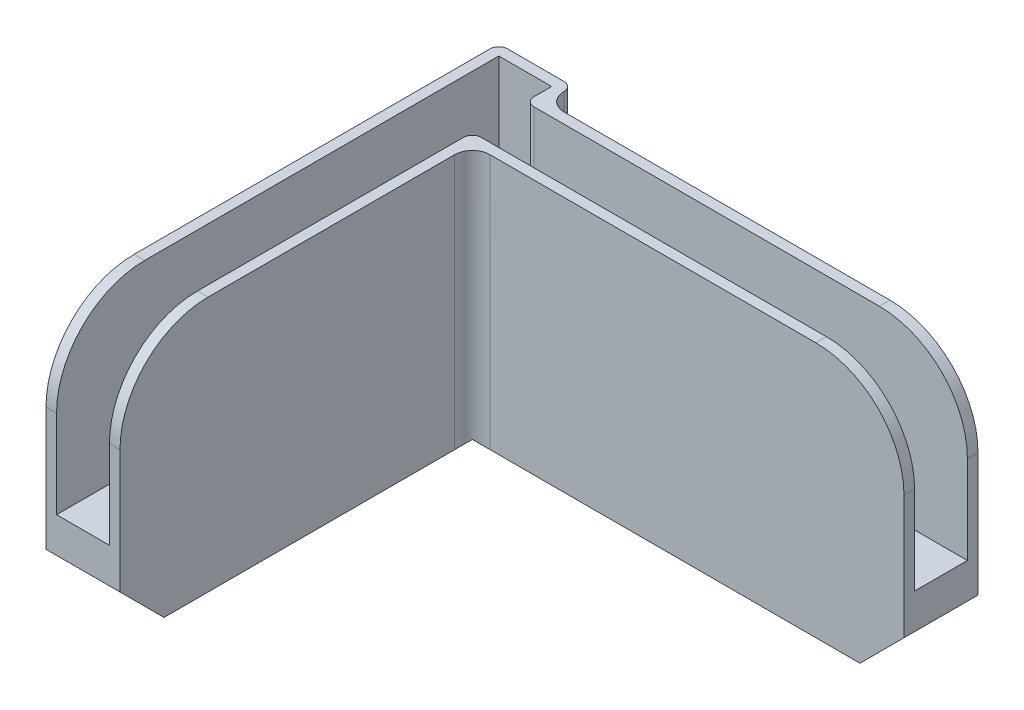
ISO-10303-21;
HEADER;
FILE_DESCRIPTION(('STEP AP214'),'2;1');
FILE_NAME('part.step','',(''),(''),'','','');
FILE_SCHEMA(('AUTOMOTIVE_DESIGN { 1 0 10303 214 1 1 1 1 }'));
ENDSEC;
DATA;
#1=APPLICATION_CONTEXT('core data for automotive mechanical design processes');
#2=APPLICATION_PROTOCOL_DEFINITION('international standard','automotive_design',2000,#1);
#3=PRODUCT_CONTEXT('',#1,'mechanical');
#4=PRODUCT('Part','Part','',(#3));
#5=PRODUCT_RELATED_PRODUCT_CATEGORY('part','',(#4));
#6=PRODUCT_DEFINITION_FORMATION('','',#4);
#7=PRODUCT_DEFINITION_CONTEXT('part definition',#1,'design');
#8=PRODUCT_DEFINITION('design','',#6,#7);
#9=PRODUCT_DEFINITION_SHAPE('','',#8);
#10=(LENGTH_UNIT() NAMED_UNIT(*) SI_UNIT(.MILLI.,.METRE.));
#11=(NAMED_UNIT(*) PLANE_ANGLE_UNIT() SI_UNIT($,.RADIAN.));
#12=(NAMED_UNIT(*) SI_UNIT($,.STERADIAN.) SOLID_ANGLE_UNIT());
#13=UNCERTAINTY_MEASURE_WITH_UNIT(LENGTH_MEASURE(1.E-05),#10,'distance_accuracy_value','');
#14=(GEOMETRIC_REPRESENTATION_CONTEXT(3) GLOBAL_UNCERTAINTY_ASSIGNED_CONTEXT((#13)) GLOBAL_UNIT_ASSIGNED_CONTEXT((#10,
#11,#12)) REPRESENTATION_CONTEXT('',''));
#15=CARTESIAN_POINT('',(0.,0.,0.));
#16=DIRECTION('',(0.,0.,1.));
#17=DIRECTION('',(1.,0.,0.));
#18=AXIS2_PLACEMENT_3D('',#15,#16,#17);
#19=CARTESIAN_POINT('',(0.,20.,0.));
#20=DIRECTION('',(0.,1.,0.));
#21=DIRECTION('',(0.,0.,1.));
#22=AXIS2_PLACEMENT_3D('',#19,#20,#21);
#23=PLANE('',#22);
#24=DIRECTION('',(0.,0.,-1.));
#25=VECTOR('',#24,1.);
#26=CARTESIAN_POINT('',(-49.,20.,-9.));
#27=LINE('',#26,#25);
#28=CARTESIAN_POINT('',(-49.,20.,-7.));
#29=VERTEX_POINT('',#28);
#30=CARTESIAN_POINT('',(-49.,20.,-9.));
#31=VERTEX_POINT('',#30);
#32=EDGE_CURVE('E329',#29,#31,#27,.T.);
#33=ORIENTED_EDGE('',*,*,#32,.F.);
#34=CARTESIAN_POINT('',(-48.,20.,-7.));
#35=DIRECTION('',(0.,1.,0.));
#36=DIRECTION('',(0.,0.,1.));
#37=AXIS2_PLACEMENT_3D('',#34,#35,#36);
#38=CIRCLE('',#37,1.);
#39=CARTESIAN_POINT('',(-48.,20.,-6.));
#40=VERTEX_POINT('',#39);
#41=EDGE_CURVE('E501',#29,#40,#38,.T.);
#42=ORIENTED_EDGE('',*,*,#41,.T.);
#43=DIRECTION('',(-1.,0.,0.));
#44=VECTOR('',#43,1.);
#45=CARTESIAN_POINT('',(-49.,20.,-6.));
#46=LINE('',#45,#44);
#47=CARTESIAN_POINT('',(-8.8,20.,-6.));
#48=VERTEX_POINT('',#47);
#49=EDGE_CURVE('E326',#48,#40,#46,.T.);
#50=ORIENTED_EDGE('',*,*,#49,.F.);
#51=DIRECTION('',(0.,0.,-1.));
#52=VECTOR('',#51,1.);
#53=CARTESIAN_POINT('',(-8.8,20.,-7.2));
#54=LINE('',#53,#52);
#55=CARTESIAN_POINT('',(-8.8,20.,-7.2));
#56=VERTEX_POINT('',#55);
#57=EDGE_CURVE('E438',#48,#56,#54,.T.);
#58=ORIENTED_EDGE('',*,*,#57,.T.);
#59=DIRECTION('',(-1.,0.,0.));
#60=VECTOR('',#59,1.);
#61=CARTESIAN_POINT('',(0.,20.,-7.2));
#62=LINE('',#61,#60);
#63=CARTESIAN_POINT('',(-45.8,20.,-7.2));
#64=VERTEX_POINT('',#63);
#65=EDGE_CURVE('E355',#56,#64,#62,.T.);
#66=ORIENTED_EDGE('',*,*,#65,.T.);
#67=CARTESIAN_POINT('',(-45.8,20.,-9.2));
#68=DIRECTION('',(0.,1.,0.));
#69=DIRECTION('',(0.,0.,1.));
#70=AXIS2_PLACEMENT_3D('',#67,#68,#69);
#71=CIRCLE('',#70,2.);
#72=CARTESIAN_POINT('',(-47.8,20.,-9.2));
#73=VERTEX_POINT('',#72);
#74=EDGE_CURVE('E490',#64,#73,#71,.F.);
#75=ORIENTED_EDGE('',*,*,#74,.T.);
#76=CARTESIAN_POINT('',(-48.8,20.,-9.2));
#77=DIRECTION('',(0.,1.,0.));
#78=DIRECTION('',(0.,0.,1.));
#79=AXIS2_PLACEMENT_3D('',#76,#77,#78);
#80=CIRCLE('',#79,1.);
#81=CARTESIAN_POINT('',(-48.8,20.,-10.2));
#82=VERTEX_POINT('',#81);
#83=EDGE_CURVE('E497',#73,#82,#80,.T.);
#84=ORIENTED_EDGE('',*,*,#83,.T.);
#85=DIRECTION('',(-1.,0.,0.));
#86=VECTOR('',#85,1.);
#87=CARTESIAN_POINT('',(0.,20.,-10.2));
#88=LINE('',#87,#86);
#89=CARTESIAN_POINT('',(-55.2,20.,-10.2));
#90=VERTEX_POINT('',#89);
#91=EDGE_CURVE('E358',#82,#90,#88,.T.);
#92=ORIENTED_EDGE('',*,*,#91,.T.);
#93=CARTESIAN_POINT('',(-55.2,20.,-9.2));
#94=DIRECTION('',(0.,1.,0.));
#95=DIRECTION('',(0.,0.,1.));
#96=AXIS2_PLACEMENT_3D('',#93,#94,#95);
#97=CIRCLE('',#96,1.);
#98=CARTESIAN_POINT('',(-56.2,20.,-9.2));
#99=VERTEX_POINT('',#98);
#100=EDGE_CURVE('E499',#90,#99,#97,.T.);
#101=ORIENTED_EDGE('',*,*,#100,.T.);
#102=DIRECTION('',(0.,0.,1.));
#103=VECTOR('',#102,1.);
#104=CARTESIAN_POINT('',(-56.2,20.,0.));
#105=LINE('',#104,#103);
#106=CARTESIAN_POINT('',(-56.2,20.,31.2));
#107=VERTEX_POINT('',#106);
#108=EDGE_CURVE('E361',#99,#107,#105,.T.);
#109=ORIENTED_EDGE('',*,*,#108,.T.);
#110=DIRECTION('',(1.,0.,0.));
#111=VECTOR('',#110,1.);
#112=CARTESIAN_POINT('',(-55.,20.,31.2));
#113=LINE('',#112,#111);
#114=CARTESIAN_POINT('',(-55.,20.,31.2));
#115=VERTEX_POINT('',#114);
#116=EDGE_CURVE('E434',#107,#115,#113,.T.);
#117=ORIENTED_EDGE('',*,*,#116,.T.);
#118=DIRECTION('',(0.,0.,1.));
#119=VECTOR('',#118,1.);
#120=CARTESIAN_POINT('',(-55.,20.,40.));
#121=LINE('',#120,#119);
#122=CARTESIAN_POINT('',(-55.,20.,-9.));
#123=VERTEX_POINT('',#122);
#124=EDGE_CURVE('E333',#123,#115,#121,.T.);
#125=ORIENTED_EDGE('',*,*,#124,.F.);
#126=DIRECTION('',(-1.,0.,0.));
#127=VECTOR('',#126,1.);
#128=CARTESIAN_POINT('',(-55.,20.,-9.));
#129=LINE('',#128,#127);
#130=EDGE_CURVE('E331',#31,#123,#129,.T.);
#131=ORIENTED_EDGE('',*,*,#130,.F.);
#132=EDGE_LOOP('',(#33,#42,#50,#58,#66,#75,#84,#92,#101,#109,#117,#125,#131));
#133=FACE_BOUND('',#132,.T.);
#134=ADVANCED_FACE('F81',(#133),#23,.T.);
#135=DIRECTION('',(1.,0.,0.));
#136=VECTOR('',#135,1.);
#137=CARTESIAN_POINT('',(0.,20.,0.));
#138=LINE('',#137,#136);
#139=CARTESIAN_POINT('',(-48.,20.,0.));
#140=VERTEX_POINT('',#139);
#141=CARTESIAN_POINT('',(-8.8,20.,0.));
#142=VERTEX_POINT('',#141);
#143=EDGE_CURVE('E338',#140,#142,#138,.T.);
#144=ORIENTED_EDGE('',*,*,#143,.F.);
#145=CARTESIAN_POINT('',(-48.,20.,1.00000000000001));
#146=DIRECTION('',(0.,1.,0.));
#147=DIRECTION('',(0.,0.,1.));
#148=AXIS2_PLACEMENT_3D('',#145,#146,#147);
#149=CIRCLE('',#148,1.);
#150=CARTESIAN_POINT('',(-49.,20.,1.00000000000001));
#151=VERTEX_POINT('',#150);
#152=EDGE_CURVE('E506',#140,#151,#149,.T.);
#153=ORIENTED_EDGE('',*,*,#152,.T.);
#154=DIRECTION('',(0.,0.,-1.));
#155=VECTOR('',#154,1.);
#156=CARTESIAN_POINT('',(-49.,20.,0.));
#157=LINE('',#156,#155);
#158=CARTESIAN_POINT('',(-49.,20.,31.2));
#159=VERTEX_POINT('',#158);
#160=EDGE_CURVE('E336',#159,#151,#157,.T.);
#161=ORIENTED_EDGE('',*,*,#160,.F.);
#162=DIRECTION('',(1.,0.,0.));
#163=VECTOR('',#162,1.);
#164=CARTESIAN_POINT('',(-47.8,20.,31.2));
#165=LINE('',#164,#163);
#166=CARTESIAN_POINT('',(-47.8,20.,31.2));
#167=VERTEX_POINT('',#166);
#168=EDGE_CURVE('E449',#159,#167,#165,.T.);
#169=ORIENTED_EDGE('',*,*,#168,.T.);
#170=DIRECTION('',(0.,0.,-1.));
#171=VECTOR('',#170,1.);
#172=CARTESIAN_POINT('',(-47.8,20.,0.));
#173=LINE('',#172,#171);
#174=CARTESIAN_POINT('',(-47.8,20.,3.20000000000001));
#175=VERTEX_POINT('',#174);
#176=EDGE_CURVE('E363',#167,#175,#173,.T.);
#177=ORIENTED_EDGE('',*,*,#176,.T.);
#178=CARTESIAN_POINT('',(-45.8,20.,3.20000000000001));
#179=DIRECTION('',(0.,1.,0.));
#180=DIRECTION('',(0.,0.,1.));
#181=AXIS2_PLACEMENT_3D('',#178,#179,#180);
#182=CIRCLE('',#181,2.);
#183=CARTESIAN_POINT('',(-45.8,20.,1.20000000000001));
#184=VERTEX_POINT('',#183);
#185=EDGE_CURVE('E486',#175,#184,#182,.F.);
#186=ORIENTED_EDGE('',*,*,#185,.T.);
#187=DIRECTION('',(1.,0.,0.));
#188=VECTOR('',#187,1.);
#189=CARTESIAN_POINT('',(0.,20.,1.2));
#190=LINE('',#189,#188);
#191=CARTESIAN_POINT('',(-8.8,20.,1.2));
#192=VERTEX_POINT('',#191);
#193=EDGE_CURVE('E366',#184,#192,#190,.T.);
#194=ORIENTED_EDGE('',*,*,#193,.T.);
#195=DIRECTION('',(0.,0.,-1.));
#196=VECTOR('',#195,1.);
#197=CARTESIAN_POINT('',(-8.8,20.,0.));
#198=LINE('',#197,#196);
#199=EDGE_CURVE('E452',#192,#142,#198,.T.);
#200=ORIENTED_EDGE('',*,*,#199,.T.);
#201=EDGE_LOOP('',(#144,#153,#161,#169,#177,#186,#194,#200));
#202=FACE_BOUND('',#201,.T.);
#203=ADVANCED_FACE('F563',(#202),#23,.T.);
#204=CARTESIAN_POINT('',(1.2,20.,0.));
#205=DIRECTION('',(-1.,0.,0.));
#206=DIRECTION('',(0.,0.,1.));
#207=AXIS2_PLACEMENT_3D('',#204,#205,#206);
#208=PLANE('',#207);
#209=DIRECTION('',(0.,-1.,0.));
#210=VECTOR('',#209,1.);
#211=CARTESIAN_POINT('',(1.2,20.,-7.2));
#212=LINE('',#211,#210);
#213=CARTESIAN_POINT('',(1.2,10.,-7.2));
#214=VERTEX_POINT('',#213);
#215=CARTESIAN_POINT('',(1.2,-3.99999999999999,-7.2));
#216=VERTEX_POINT('',#215);
#217=EDGE_CURVE('E374',#214,#216,#212,.T.);
#218=ORIENTED_EDGE('',*,*,#217,.F.);
#219=DIRECTION('',(0.,0.,-1.));
#220=VECTOR('',#219,1.);
#221=CARTESIAN_POINT('',(1.2,10.,-6.));
#222=LINE('',#221,#220);
#223=CARTESIAN_POINT('',(1.2,10.,-6.));
#224=VERTEX_POINT('',#223);
#225=EDGE_CURVE('E445',#214,#224,#222,.F.);
#226=ORIENTED_EDGE('',*,*,#225,.T.);
#227=DIRECTION('',(0.,1.,0.));
#228=VECTOR('',#227,1.);
#229=CARTESIAN_POINT('',(1.2,0.,-6.));
#230=LINE('',#229,#228);
#231=CARTESIAN_POINT('',(1.2,0.,-6.));
#232=VERTEX_POINT('',#231);
#233=EDGE_CURVE('E316',#232,#224,#230,.T.);
#234=ORIENTED_EDGE('',*,*,#233,.F.);
#235=DIRECTION('',(0.,0.,-1.));
#236=VECTOR('',#235,1.);
#237=CARTESIAN_POINT('',(1.2,0.,0.));
#238=LINE('',#237,#236);
#239=CARTESIAN_POINT('',(1.2,0.,0.));
#240=VERTEX_POINT('',#239);
#241=EDGE_CURVE('E319',#240,#232,#238,.T.);
#242=ORIENTED_EDGE('',*,*,#241,.F.);
#243=DIRECTION('',(0.,-1.,0.));
#244=VECTOR('',#243,1.);
#245=CARTESIAN_POINT('',(1.2,0.,0.));
#246=LINE('',#245,#244);
#247=CARTESIAN_POINT('',(1.2,10.,0.));
#248=VERTEX_POINT('',#247);
#249=EDGE_CURVE('E322',#248,#240,#246,.T.);
#250=ORIENTED_EDGE('',*,*,#249,.F.);
#251=DIRECTION('',(0.,0.,-1.));
#252=VECTOR('',#251,1.);
#253=CARTESIAN_POINT('',(1.2,10.,1.2));
#254=LINE('',#253,#252);
#255=CARTESIAN_POINT('',(1.2,10.,1.2));
#256=VERTEX_POINT('',#255);
#257=EDGE_CURVE('E443',#248,#256,#254,.F.);
#258=ORIENTED_EDGE('',*,*,#257,.T.);
#259=DIRECTION('',(0.,-1.,0.));
#260=VECTOR('',#259,1.);
#261=CARTESIAN_POINT('',(1.2,20.,1.2));
#262=LINE('',#261,#260);
#263=CARTESIAN_POINT('',(1.2,-3.99999999999999,1.2));
#264=VERTEX_POINT('',#263);
#265=EDGE_CURVE('E368',#256,#264,#262,.T.);
#266=ORIENTED_EDGE('',*,*,#265,.T.);
#267=DIRECTION('',(0.,0.,-1.));
#268=VECTOR('',#267,1.);
#269=CARTESIAN_POINT('',(1.2,-3.99999999999999,0.));
#270=LINE('',#269,#268);
#271=EDGE_CURVE('E399',#264,#216,#270,.T.);
#272=ORIENTED_EDGE('',*,*,#271,.T.);
#273=EDGE_LOOP('',(#218,#226,#234,#242,#250,#258,#266,#272));
#274=FACE_BOUND('',#273,.T.);
#275=ADVANCED_FACE('F569',(#274),#208,.F.);
#276=CARTESIAN_POINT('',(0.,20.,-7.2));
#277=DIRECTION('',(0.,0.,1.));
#278=DIRECTION('',(1.,0.,0.));
#279=AXIS2_PLACEMENT_3D('',#276,#277,#278);
#280=PLANE('',#279);
#281=DIRECTION('',(1.,0.,0.));
#282=VECTOR('',#281,1.);
#283=CARTESIAN_POINT('',(0.,-7.,-7.2));
#284=LINE('',#283,#282);
#285=CARTESIAN_POINT('',(-1.8,-7.,-7.2));
#286=VERTEX_POINT('',#285);
#287=CARTESIAN_POINT('',(-45.8,-7.,-7.2));
#288=VERTEX_POINT('',#287);
#289=EDGE_CURVE('E386',#286,#288,#284,.F.);
#290=ORIENTED_EDGE('',*,*,#289,.T.);
#291=DIRECTION('',(0.,-1.,0.));
#292=VECTOR('',#291,1.);
#293=CARTESIAN_POINT('',(-45.8,20.,-7.2));
#294=LINE('',#293,#292);
#295=EDGE_CURVE('E479',#288,#64,#294,.F.);
#296=ORIENTED_EDGE('',*,*,#295,.T.);
#297=ORIENTED_EDGE('',*,*,#65,.F.);
#298=CARTESIAN_POINT('',(-8.8,10.,-7.2));
#299=DIRECTION('',(0.,0.,1.));
#300=DIRECTION('',(1.,0.,0.));
#301=AXIS2_PLACEMENT_3D('',#298,#299,#300);
#302=CIRCLE('',#301,10.);
#303=EDGE_CURVE('E441',#56,#214,#302,.F.);
#304=ORIENTED_EDGE('',*,*,#303,.T.);
#305=ORIENTED_EDGE('',*,*,#217,.T.);
#306=DIRECTION('',(0.707106781186546,0.707106781186549,0.));
#307=VECTOR('',#306,1.);
#308=CARTESIAN_POINT('',(-4.79999999999999,-10.,-7.2));
#309=LINE('',#308,#307);
#310=EDGE_CURVE('E384',#216,#286,#309,.F.);
#311=ORIENTED_EDGE('',*,*,#310,.T.);
#312=EDGE_LOOP('',(#290,#296,#297,#304,#305,#311));
#313=FACE_BOUND('',#312,.T.);
#314=ADVANCED_FACE('F541',(#313),#280,.F.);
#315=CARTESIAN_POINT('',(0.,20.,-10.2));
#316=DIRECTION('',(0.,0.,1.));
#317=DIRECTION('',(1.,0.,0.));
#318=AXIS2_PLACEMENT_3D('',#315,#316,#317);
#319=PLANE('',#318);
#320=DIRECTION('',(-1.,0.,0.));
#321=VECTOR('',#320,1.);
#322=CARTESIAN_POINT('',(0.,-3.99999999999999,-10.2));
#323=LINE('',#322,#321);
#324=CARTESIAN_POINT('',(-48.8,-3.99999999999999,-10.2));
#325=VERTEX_POINT('',#324);
#326=CARTESIAN_POINT('',(-55.2,-3.99999999999999,-10.2));
#327=VERTEX_POINT('',#326);
#328=EDGE_CURVE('E389',#325,#327,#323,.T.);
#329=ORIENTED_EDGE('',*,*,#328,.T.);
#330=DIRECTION('',(0.,-1.,0.));
#331=VECTOR('',#330,1.);
#332=CARTESIAN_POINT('',(-55.2,20.,-10.2));
#333=LINE('',#332,#331);
#334=EDGE_CURVE('E515',#327,#90,#333,.F.);
#335=ORIENTED_EDGE('',*,*,#334,.T.);
#336=ORIENTED_EDGE('',*,*,#91,.F.);
#337=DIRECTION('',(0.,-1.,0.));
#338=VECTOR('',#337,1.);
#339=CARTESIAN_POINT('',(-48.8,20.,-10.2));
#340=LINE('',#339,#338);
#341=EDGE_CURVE('E513',#82,#325,#340,.T.);
#342=ORIENTED_EDGE('',*,*,#341,.T.);
#343=EDGE_LOOP('',(#329,#335,#336,#342));
#344=FACE_BOUND('',#343,.T.);
#345=ADVANCED_FACE('F553',(#344),#319,.F.);
#346=CARTESIAN_POINT('',(-56.2,20.,0.));
#347=DIRECTION('',(1.,0.,0.));
#348=DIRECTION('',(0.,0.,-1.));
#349=AXIS2_PLACEMENT_3D('',#346,#347,#348);
#350=PLANE('',#349);
#351=ORIENTED_EDGE('',*,*,#108,.F.);
#352=DIRECTION('',(0.,-1.,0.));
#353=VECTOR('',#352,1.);
#354=CARTESIAN_POINT('',(-56.2,20.,-9.2));
#355=LINE('',#354,#353);
#356=CARTESIAN_POINT('',(-56.2,-4.99999999999999,-9.2));
#357=VERTEX_POINT('',#356);
#358=EDGE_CURVE('E508',#99,#357,#355,.T.);
#359=ORIENTED_EDGE('',*,*,#358,.T.);
#360=DIRECTION('',(0.,0.707106781186549,-0.707106781186546));
#361=VECTOR('',#360,1.);
#362=CARTESIAN_POINT('',(-56.2,-10.,-4.20000000000001));
#363=LINE('',#362,#361);
#364=CARTESIAN_POINT('',(-56.2,-8.99999999999998,-5.20000000000002));
#365=VERTEX_POINT('',#364);
#366=EDGE_CURVE('E394',#357,#365,#363,.F.);
#367=ORIENTED_EDGE('',*,*,#366,.T.);
#368=DIRECTION('',(0.,0.,1.));
#369=VECTOR('',#368,1.);
#370=CARTESIAN_POINT('',(-56.2,-8.99999999999998,0.));
#371=LINE('',#370,#369);
#372=CARTESIAN_POINT('',(-56.2,-8.99999999999998,36.2));
#373=VERTEX_POINT('',#372);
#374=EDGE_CURVE('E432',#365,#373,#371,.T.);
#375=ORIENTED_EDGE('',*,*,#374,.T.);
#376=DIRECTION('',(0.,-0.707106781186549,-0.707106781186546));
#377=VECTOR('',#376,1.);
#378=CARTESIAN_POINT('',(-56.2,-10.,35.2));
#379=LINE('',#378,#377);
#380=CARTESIAN_POINT('',(-56.2,-3.99999999999999,41.2));
#381=VERTEX_POINT('',#380);
#382=EDGE_CURVE('E391',#373,#381,#379,.F.);
#383=ORIENTED_EDGE('',*,*,#382,.T.);
#384=DIRECTION('',(0.,-1.,0.));
#385=VECTOR('',#384,1.);
#386=CARTESIAN_POINT('',(-56.2,20.,41.2));
#387=LINE('',#386,#385);
#388=CARTESIAN_POINT('',(-56.2,10.,41.2));
#389=VERTEX_POINT('',#388);
#390=EDGE_CURVE('E372',#389,#381,#387,.T.);
#391=ORIENTED_EDGE('',*,*,#390,.F.);
#392=CARTESIAN_POINT('',(-56.2,10.,31.2));
#393=DIRECTION('',(1.,0.,0.));
#394=DIRECTION('',(0.,0.,-1.));
#395=AXIS2_PLACEMENT_3D('',#392,#393,#394);
#396=CIRCLE('',#395,10.);
#397=EDGE_CURVE('E469',#389,#107,#396,.F.);
#398=ORIENTED_EDGE('',*,*,#397,.T.);
#399=EDGE_LOOP('',(#351,#359,#367,#375,#383,#391,#398));
#400=FACE_BOUND('',#399,.T.);
#401=ADVANCED_FACE('F584',(#400),#350,.F.);
#402=CARTESIAN_POINT('',(0.,20.,41.2));
#403=DIRECTION('',(0.,0.,-1.));
#404=DIRECTION('',(-1.,0.,0.));
#405=AXIS2_PLACEMENT_3D('',#402,#403,#404);
#406=PLANE('',#405);
#407=DIRECTION('',(0.,-1.,0.));
#408=VECTOR('',#407,1.);
#409=CARTESIAN_POINT('',(-47.8,20.,41.2));
#410=LINE('',#409,#408);
#411=CARTESIAN_POINT('',(-47.8,10.,41.2));
#412=VERTEX_POINT('',#411);
#413=CARTESIAN_POINT('',(-47.8,-3.99999999999999,41.2));
#414=VERTEX_POINT('',#413);
#415=EDGE_CURVE('E370',#412,#414,#410,.T.);
#416=ORIENTED_EDGE('',*,*,#415,.F.);
#417=DIRECTION('',(1.,0.,0.));
#418=VECTOR('',#417,1.);
#419=CARTESIAN_POINT('',(-49.,10.,41.2));
#420=LINE('',#419,#418);
#421=CARTESIAN_POINT('',(-49.,10.,41.2));
#422=VERTEX_POINT('',#421);
#423=EDGE_CURVE('E312',#412,#422,#420,.F.);
#424=ORIENTED_EDGE('',*,*,#423,.T.);
#425=DIRECTION('',(0.,1.,0.));
#426=VECTOR('',#425,1.);
#427=CARTESIAN_POINT('',(-49.,0.,41.2));
#428=LINE('',#427,#426);
#429=CARTESIAN_POINT('',(-49.,0.,41.2));
#430=VERTEX_POINT('',#429);
#431=EDGE_CURVE('E291',#430,#422,#428,.T.);
#432=ORIENTED_EDGE('',*,*,#431,.F.);
#433=DIRECTION('',(1.,0.,0.));
#434=VECTOR('',#433,1.);
#435=CARTESIAN_POINT('',(-55.,0.,41.2));
#436=LINE('',#435,#434);
#437=CARTESIAN_POINT('',(-55.,0.,41.2));
#438=VERTEX_POINT('',#437);
#439=EDGE_CURVE('E301',#438,#430,#436,.T.);
#440=ORIENTED_EDGE('',*,*,#439,.F.);
#441=DIRECTION('',(0.,-1.,0.));
#442=VECTOR('',#441,1.);
#443=CARTESIAN_POINT('',(-55.,0.,41.2));
#444=LINE('',#443,#442);
#445=CARTESIAN_POINT('',(-55.,10.,41.2));
#446=VERTEX_POINT('',#445);
#447=EDGE_CURVE('E307',#446,#438,#444,.T.);
#448=ORIENTED_EDGE('',*,*,#447,.F.);
#449=DIRECTION('',(1.,0.,0.));
#450=VECTOR('',#449,1.);
#451=CARTESIAN_POINT('',(-56.2,10.,41.2));
#452=LINE('',#451,#450);
#453=EDGE_CURVE('E462',#446,#389,#452,.F.);
#454=ORIENTED_EDGE('',*,*,#453,.T.);
#455=ORIENTED_EDGE('',*,*,#390,.T.);
#456=DIRECTION('',(1.,0.,0.));
#457=VECTOR('',#456,1.);
#458=CARTESIAN_POINT('',(0.,-3.99999999999999,41.2));
#459=LINE('',#458,#457);
#460=EDGE_CURVE('E402',#381,#414,#459,.T.);
#461=ORIENTED_EDGE('',*,*,#460,.T.);
#462=EDGE_LOOP('',(#416,#424,#432,#440,#448,#454,#455,#461));
#463=FACE_BOUND('',#462,.T.);
#464=ADVANCED_FACE('F310',(#463),#406,.F.);
#465=CARTESIAN_POINT('',(-47.8,20.,0.));
#466=DIRECTION('',(-1.,0.,0.));
#467=DIRECTION('',(0.,0.,1.));
#468=AXIS2_PLACEMENT_3D('',#465,#466,#467);
#469=PLANE('',#468);
#470=DIRECTION('',(0.,0.,-1.));
#471=VECTOR('',#470,1.);
#472=CARTESIAN_POINT('',(-47.8,-8.99999999999998,0.));
#473=LINE('',#472,#471);
#474=CARTESIAN_POINT('',(-47.8,-8.99999999999999,36.2));
#475=VERTEX_POINT('',#474);
#476=CARTESIAN_POINT('',(-47.8,-8.99999999999998,3.20000000000001));
#477=VERTEX_POINT('',#476);
#478=EDGE_CURVE('E426',#475,#477,#473,.T.);
#479=ORIENTED_EDGE('',*,*,#478,.T.);
#480=DIRECTION('',(0.,-1.,0.));
#481=VECTOR('',#480,1.);
#482=CARTESIAN_POINT('',(-47.8,20.,3.20000000000001));
#483=LINE('',#482,#481);
#484=EDGE_CURVE('E475',#477,#175,#483,.F.);
#485=ORIENTED_EDGE('',*,*,#484,.T.);
#486=ORIENTED_EDGE('',*,*,#176,.F.);
#487=CARTESIAN_POINT('',(-47.8,10.,31.2));
#488=DIRECTION('',(-1.,0.,0.));
#489=DIRECTION('',(0.,0.,1.));
#490=AXIS2_PLACEMENT_3D('',#487,#488,#489);
#491=CIRCLE('',#490,10.);
#492=EDGE_CURVE('E460',#167,#412,#491,.F.);
#493=ORIENTED_EDGE('',*,*,#492,.T.);
#494=ORIENTED_EDGE('',*,*,#415,.T.);
#495=DIRECTION('',(0.,0.707106781186549,0.707106781186546));
#496=VECTOR('',#495,1.);
#497=CARTESIAN_POINT('',(-47.8,-9.99999999999999,35.2));
#498=LINE('',#497,#496);
#499=EDGE_CURVE('E405',#414,#475,#498,.F.);
#500=ORIENTED_EDGE('',*,*,#499,.T.);
#501=EDGE_LOOP('',(#479,#485,#486,#493,#494,#500));
#502=FACE_BOUND('',#501,.T.);
#503=ADVANCED_FACE('F577',(#502),#469,.F.);
#504=CARTESIAN_POINT('',(0.,20.,1.2));
#505=DIRECTION('',(0.,0.,-1.));
#506=DIRECTION('',(-1.,0.,0.));
#507=AXIS2_PLACEMENT_3D('',#504,#505,#506);
#508=PLANE('',#507);
#509=ORIENTED_EDGE('',*,*,#193,.F.);
#510=DIRECTION('',(0.,-1.,0.));
#511=VECTOR('',#510,1.);
#512=CARTESIAN_POINT('',(-45.8,-8.99999999999998,1.20000000000001));
#513=LINE('',#512,#511);
#514=CARTESIAN_POINT('',(-45.8,-8.99999999999998,1.20000000000001));
#515=VERTEX_POINT('',#514);
#516=EDGE_CURVE('E472',#184,#515,#513,.T.);
#517=ORIENTED_EDGE('',*,*,#516,.T.);
#518=DIRECTION('',(1.,0.,0.));
#519=VECTOR('',#518,1.);
#520=CARTESIAN_POINT('',(0.,-8.99999999999998,1.2));
#521=LINE('',#520,#519);
#522=CARTESIAN_POINT('',(-3.79999999999998,-8.99999999999998,1.2));
#523=VERTEX_POINT('',#522);
#524=EDGE_CURVE('E418',#515,#523,#521,.T.);
#525=ORIENTED_EDGE('',*,*,#524,.T.);
#526=DIRECTION('',(-0.707106781186546,-0.707106781186549,0.));
#527=VECTOR('',#526,1.);
#528=CARTESIAN_POINT('',(-4.79999999999999,-10.,1.2));
#529=LINE('',#528,#527);
#530=EDGE_CURVE('E396',#523,#264,#529,.F.);
#531=ORIENTED_EDGE('',*,*,#530,.T.);
#532=ORIENTED_EDGE('',*,*,#265,.F.);
#533=CARTESIAN_POINT('',(-8.8,10.,1.2));
#534=DIRECTION('',(0.,0.,-1.));
#535=DIRECTION('',(-1.,0.,0.));
#536=AXIS2_PLACEMENT_3D('',#533,#534,#535);
#537=CIRCLE('',#536,10.);
#538=EDGE_CURVE('E457',#256,#192,#537,.F.);
#539=ORIENTED_EDGE('',*,*,#538,.T.);
#540=EDGE_LOOP('',(#509,#517,#525,#531,#532,#539));
#541=FACE_BOUND('',#540,.T.);
#542=ADVANCED_FACE('F574',(#541),#508,.F.);
#543=CARTESIAN_POINT('',(-49.,20.,-6.));
#544=DIRECTION('',(0.,0.,1.));
#545=DIRECTION('',(1.,0.,0.));
#546=AXIS2_PLACEMENT_3D('',#543,#544,#545);
#547=PLANE('',#546);
#548=ORIENTED_EDGE('',*,*,#49,.T.);
#549=DIRECTION('',(0.,-1.,0.));
#550=VECTOR('',#549,1.);
#551=CARTESIAN_POINT('',(-48.,20.,-6.));
#552=LINE('',#551,#550);
#553=CARTESIAN_POINT('',(-48.,0.,-6.));
#554=VERTEX_POINT('',#553);
#555=EDGE_CURVE('E492',#40,#554,#552,.T.);
#556=ORIENTED_EDGE('',*,*,#555,.T.);
#557=DIRECTION('',(-1.,0.,0.));
#558=VECTOR('',#557,1.);
#559=CARTESIAN_POINT('',(-49.,0.,-6.));
#560=LINE('',#559,#558);
#561=EDGE_CURVE('E341',#232,#554,#560,.T.);
#562=ORIENTED_EDGE('',*,*,#561,.F.);
#563=ORIENTED_EDGE('',*,*,#233,.T.);
#564=CARTESIAN_POINT('',(-8.8,10.,-6.));
#565=DIRECTION('',(0.,0.,1.));
#566=DIRECTION('',(1.,0.,0.));
#567=AXIS2_PLACEMENT_3D('',#564,#565,#566);
#568=CIRCLE('',#567,10.);
#569=EDGE_CURVE('E447',#224,#48,#568,.T.);
#570=ORIENTED_EDGE('',*,*,#569,.T.);
#571=EDGE_LOOP('',(#548,#556,#562,#563,#570));
#572=FACE_BOUND('',#571,.T.);
#573=ADVANCED_FACE('F532',(#572),#547,.T.);
#574=CARTESIAN_POINT('',(-49.,20.,-9.));
#575=DIRECTION('',(-1.,0.,0.));
#576=DIRECTION('',(0.,0.,1.));
#577=AXIS2_PLACEMENT_3D('',#574,#575,#576);
#578=PLANE('',#577);
#579=DIRECTION('',(0.,0.,-1.));
#580=VECTOR('',#579,1.);
#581=CARTESIAN_POINT('',(-49.,0.,-9.));
#582=LINE('',#581,#580);
#583=CARTESIAN_POINT('',(-49.,0.,-7.));
#584=VERTEX_POINT('',#583);
#585=CARTESIAN_POINT('',(-49.,0.,-9.));
#586=VERTEX_POINT('',#585);
#587=EDGE_CURVE('E344',#584,#586,#582,.T.);
#588=ORIENTED_EDGE('',*,*,#587,.F.);
#589=DIRECTION('',(0.,-1.,0.));
#590=VECTOR('',#589,1.);
#591=CARTESIAN_POINT('',(-49.,20.,-7.));
#592=LINE('',#591,#590);
#593=EDGE_CURVE('E495',#584,#29,#592,.F.);
#594=ORIENTED_EDGE('',*,*,#593,.T.);
#595=ORIENTED_EDGE('',*,*,#32,.T.);
#596=DIRECTION('',(0.,-1.,0.));
#597=VECTOR('',#596,1.);
#598=CARTESIAN_POINT('',(-49.,20.,-9.));
#599=LINE('',#598,#597);
#600=EDGE_CURVE('E352',#31,#586,#599,.T.);
#601=ORIENTED_EDGE('',*,*,#600,.T.);
#602=EDGE_LOOP('',(#588,#594,#595,#601));
#603=FACE_BOUND('',#602,.T.);
#604=ADVANCED_FACE('F521',(#603),#578,.T.);
#605=CARTESIAN_POINT('',(-55.,20.,-9.));
#606=DIRECTION('',(0.,0.,1.));
#607=DIRECTION('',(1.,0.,0.));
#608=AXIS2_PLACEMENT_3D('',#605,#606,#607);
#609=PLANE('',#608);
#610=DIRECTION('',(-1.,0.,0.));
#611=VECTOR('',#610,1.);
#612=CARTESIAN_POINT('',(-55.,0.,-9.));
#613=LINE('',#612,#611);
#614=CARTESIAN_POINT('',(-55.,0.,-9.));
#615=VERTEX_POINT('',#614);
#616=EDGE_CURVE('E347',#586,#615,#613,.T.);
#617=ORIENTED_EDGE('',*,*,#616,.F.);
#618=ORIENTED_EDGE('',*,*,#600,.F.);
#619=ORIENTED_EDGE('',*,*,#130,.T.);
#620=DIRECTION('',(0.,-1.,0.));
#621=VECTOR('',#620,1.);
#622=CARTESIAN_POINT('',(-55.,20.,-9.));
#623=LINE('',#622,#621);
#624=EDGE_CURVE('E340',#123,#615,#623,.T.);
#625=ORIENTED_EDGE('',*,*,#624,.T.);
#626=EDGE_LOOP('',(#617,#618,#619,#625));
#627=FACE_BOUND('',#626,.T.);
#628=ADVANCED_FACE('F685',(#627),#609,.T.);
#629=CARTESIAN_POINT('',(-55.,20.,40.));
#630=DIRECTION('',(1.,0.,0.));
#631=DIRECTION('',(0.,0.,-1.));
#632=AXIS2_PLACEMENT_3D('',#629,#630,#631);
#633=PLANE('',#632);
#634=ORIENTED_EDGE('',*,*,#124,.T.);
#635=CARTESIAN_POINT('',(-55.,10.,31.2));
#636=DIRECTION('',(1.,0.,0.));
#637=DIRECTION('',(0.,0.,-1.));
#638=AXIS2_PLACEMENT_3D('',#635,#636,#637);
#639=CIRCLE('',#638,10.);
#640=EDGE_CURVE('E467',#115,#446,#639,.T.);
#641=ORIENTED_EDGE('',*,*,#640,.T.);
#642=ORIENTED_EDGE('',*,*,#447,.T.);
#643=DIRECTION('',(0.,0.,1.));
#644=VECTOR('',#643,1.);
#645=CARTESIAN_POINT('',(-55.,0.,40.));
#646=LINE('',#645,#644);
#647=EDGE_CURVE('E297',#615,#438,#646,.T.);
#648=ORIENTED_EDGE('',*,*,#647,.F.);
#649=ORIENTED_EDGE('',*,*,#624,.F.);
#650=EDGE_LOOP('',(#634,#641,#642,#648,#649));
#651=FACE_BOUND('',#650,.T.);
#652=ADVANCED_FACE('F683',(#651),#633,.T.);
#653=CARTESIAN_POINT('',(-49.,20.,0.));
#654=DIRECTION('',(-1.,0.,0.));
#655=DIRECTION('',(0.,0.,1.));
#656=AXIS2_PLACEMENT_3D('',#653,#654,#655);
#657=PLANE('',#656);
#658=ORIENTED_EDGE('',*,*,#160,.T.);
#659=DIRECTION('',(0.,-1.,0.));
#660=VECTOR('',#659,1.);
#661=CARTESIAN_POINT('',(-49.,20.,1.00000000000001));
#662=LINE('',#661,#660);
#663=CARTESIAN_POINT('',(-49.,0.,1.00000000000001));
#664=VERTEX_POINT('',#663);
#665=EDGE_CURVE('E294',#151,#664,#662,.T.);
#666=ORIENTED_EDGE('',*,*,#665,.T.);
#667=DIRECTION('',(0.,0.,-1.));
#668=VECTOR('',#667,1.);
#669=CARTESIAN_POINT('',(-49.,0.,0.));
#670=LINE('',#669,#668);
#671=EDGE_CURVE('E286',#430,#664,#670,.T.);
#672=ORIENTED_EDGE('',*,*,#671,.F.);
#673=ORIENTED_EDGE('',*,*,#431,.T.);
#674=CARTESIAN_POINT('',(-49.,10.,31.2));
#675=DIRECTION('',(-1.,0.,0.));
#676=DIRECTION('',(0.,0.,1.));
#677=AXIS2_PLACEMENT_3D('',#674,#675,#676);
#678=CIRCLE('',#677,10.);
#679=EDGE_CURVE('E465',#422,#159,#678,.T.);
#680=ORIENTED_EDGE('',*,*,#679,.T.);
#681=EDGE_LOOP('',(#658,#666,#672,#673,#680));
#682=FACE_BOUND('',#681,.T.);
#683=ADVANCED_FACE('F289',(#682),#657,.T.);
#684=CARTESIAN_POINT('',(0.,20.,0.));
#685=DIRECTION('',(0.,0.,-1.));
#686=DIRECTION('',(-1.,0.,0.));
#687=AXIS2_PLACEMENT_3D('',#684,#685,#686);
#688=PLANE('',#687);
#689=DIRECTION('',(1.,0.,0.));
#690=VECTOR('',#689,1.);
#691=CARTESIAN_POINT('',(0.,0.,0.));
#692=LINE('',#691,#690);
#693=CARTESIAN_POINT('',(-48.,0.,0.));
#694=VERTEX_POINT('',#693);
#695=EDGE_CURVE('E296',#694,#240,#692,.T.);
#696=ORIENTED_EDGE('',*,*,#695,.F.);
#697=DIRECTION('',(0.,-1.,0.));
#698=VECTOR('',#697,1.);
#699=CARTESIAN_POINT('',(-48.,20.,0.));
#700=LINE('',#699,#698);
#701=EDGE_CURVE('E504',#694,#140,#700,.F.);
#702=ORIENTED_EDGE('',*,*,#701,.T.);
#703=ORIENTED_EDGE('',*,*,#143,.T.);
#704=CARTESIAN_POINT('',(-8.8,10.,0.));
#705=DIRECTION('',(0.,0.,-1.));
#706=DIRECTION('',(-1.,0.,0.));
#707=AXIS2_PLACEMENT_3D('',#704,#705,#706);
#708=CIRCLE('',#707,10.);
#709=EDGE_CURVE('E455',#142,#248,#708,.T.);
#710=ORIENTED_EDGE('',*,*,#709,.T.);
#711=ORIENTED_EDGE('',*,*,#249,.T.);
#712=EDGE_LOOP('',(#696,#702,#703,#710,#711));
#713=FACE_BOUND('',#712,.T.);
#714=ADVANCED_FACE('F666',(#713),#688,.T.);
#715=CARTESIAN_POINT('',(0.,0.,0.));
#716=DIRECTION('',(0.,1.,0.));
#717=DIRECTION('',(0.,0.,1.));
#718=AXIS2_PLACEMENT_3D('',#715,#716,#717);
#719=PLANE('',#718);
#720=ORIENTED_EDGE('',*,*,#671,.T.);
#721=CARTESIAN_POINT('',(-48.,0.,1.00000000000001));
#722=DIRECTION('',(0.,1.,0.));
#723=DIRECTION('',(0.,0.,1.));
#724=AXIS2_PLACEMENT_3D('',#721,#722,#723);
#725=CIRCLE('',#724,1.);
#726=EDGE_CURVE('E12',#664,#694,#725,.F.);
#727=ORIENTED_EDGE('',*,*,#726,.T.);
#728=ORIENTED_EDGE('',*,*,#695,.T.);
#729=ORIENTED_EDGE('',*,*,#241,.T.);
#730=ORIENTED_EDGE('',*,*,#561,.T.);
#731=CARTESIAN_POINT('',(-48.,0.,-7.));
#732=DIRECTION('',(0.,1.,0.));
#733=DIRECTION('',(0.,0.,1.));
#734=AXIS2_PLACEMENT_3D('',#731,#732,#733);
#735=CIRCLE('',#734,1.);
#736=EDGE_CURVE('E89',#554,#584,#735,.F.);
#737=ORIENTED_EDGE('',*,*,#736,.T.);
#738=ORIENTED_EDGE('',*,*,#587,.T.);
#739=ORIENTED_EDGE('',*,*,#616,.T.);
#740=ORIENTED_EDGE('',*,*,#647,.T.);
#741=ORIENTED_EDGE('',*,*,#439,.T.);
#742=EDGE_LOOP('',(#720,#727,#728,#729,#730,#737,#738,#739,#740,#741));
#743=FACE_BOUND('',#742,.T.);
#744=ADVANCED_FACE('F302',(#743),#719,.T.);
#745=CARTESIAN_POINT('',(0.,-10.,0.));
#746=DIRECTION('',(0.,1.,0.));
#747=DIRECTION('',(0.,0.,1.));
#748=AXIS2_PLACEMENT_3D('',#745,#746,#747);
#749=PLANE('',#748);
#750=DIRECTION('',(0.,0.,1.));
#751=VECTOR('',#750,1.);
#752=CARTESIAN_POINT('',(-4.79999999999999,-10.,0.));
#753=LINE('',#752,#751);
#754=CARTESIAN_POINT('',(-4.79999999999999,-10.,-4.20000000000001));
#755=VERTEX_POINT('',#754);
#756=CARTESIAN_POINT('',(-4.79999999999999,-10.,0.2));
#757=VERTEX_POINT('',#756);
#758=EDGE_CURVE('E379',#755,#757,#753,.T.);
#759=ORIENTED_EDGE('',*,*,#758,.T.);
#760=DIRECTION('',(-1.,0.,0.));
#761=VECTOR('',#760,1.);
#762=CARTESIAN_POINT('',(0.,-10.,0.199999999999999));
#763=LINE('',#762,#761);
#764=CARTESIAN_POINT('',(-48.8,-10.,0.200000000000006));
#765=VERTEX_POINT('',#764);
#766=EDGE_CURVE('E415',#757,#765,#763,.T.);
#767=ORIENTED_EDGE('',*,*,#766,.T.);
#768=DIRECTION('',(0.,0.,1.));
#769=VECTOR('',#768,1.);
#770=CARTESIAN_POINT('',(-48.8,-10.,0.));
#771=LINE('',#770,#769);
#772=CARTESIAN_POINT('',(-48.8,-10.,35.2));
#773=VERTEX_POINT('',#772);
#774=EDGE_CURVE('E413',#765,#773,#771,.T.);
#775=ORIENTED_EDGE('',*,*,#774,.T.);
#776=DIRECTION('',(-1.,0.,0.));
#777=VECTOR('',#776,1.);
#778=CARTESIAN_POINT('',(0.,-10.,35.2));
#779=LINE('',#778,#777);
#780=CARTESIAN_POINT('',(-55.2,-10.,35.2));
#781=VERTEX_POINT('',#780);
#782=EDGE_CURVE('E376',#773,#781,#779,.T.);
#783=ORIENTED_EDGE('',*,*,#782,.T.);
#784=DIRECTION('',(0.,0.,-1.));
#785=VECTOR('',#784,1.);
#786=CARTESIAN_POINT('',(-55.2,-10.,0.));
#787=LINE('',#786,#785);
#788=CARTESIAN_POINT('',(-55.2,-10.,-4.20000000000001));
#789=VERTEX_POINT('',#788);
#790=EDGE_CURVE('E408',#781,#789,#787,.T.);
#791=ORIENTED_EDGE('',*,*,#790,.T.);
#792=DIRECTION('',(1.,0.,0.));
#793=VECTOR('',#792,1.);
#794=CARTESIAN_POINT('',(0.,-10.,-4.20000000000001));
#795=LINE('',#794,#793);
#796=EDGE_CURVE('E382',#789,#755,#795,.T.);
#797=ORIENTED_EDGE('',*,*,#796,.T.);
#798=EDGE_LOOP('',(#759,#767,#775,#783,#791,#797));
#799=FACE_BOUND('',#798,.T.);
#800=ADVANCED_FACE('F602',(#799),#749,.F.);
#801=CARTESIAN_POINT('',(-4.79999999999999,-10.,0.));
#802=DIRECTION('',(-0.707106781186549,0.707106781186546,0.));
#803=DIRECTION('',(0.,0.,1.));
#804=AXIS2_PLACEMENT_3D('',#801,#802,#803);
#805=PLANE('',#804);
#806=ORIENTED_EDGE('',*,*,#530,.F.);
#807=DIRECTION('',(-0.577350269189627,-0.57735026918963,-0.57735026918962));
#808=VECTOR('',#807,1.);
#809=CARTESIAN_POINT('',(-4.86666666666666,-10.0666666666667,0.133333333333334));
#810=LINE('',#809,#808);
#811=EDGE_CURVE('E420',#523,#757,#810,.T.);
#812=ORIENTED_EDGE('',*,*,#811,.T.);
#813=ORIENTED_EDGE('',*,*,#758,.F.);
#814=DIRECTION('',(0.577350269189625,0.577350269189627,-0.577350269189625));
#815=VECTOR('',#814,1.);
#816=CARTESIAN_POINT('',(-6.19999999999999,-11.4,-2.80000000000001));
#817=LINE('',#816,#815);
#818=EDGE_CURVE('E345',#286,#755,#817,.F.);
#819=ORIENTED_EDGE('',*,*,#818,.F.);
#820=ORIENTED_EDGE('',*,*,#310,.F.);
#821=ORIENTED_EDGE('',*,*,#271,.F.);
#822=EDGE_LOOP('',(#806,#812,#813,#819,#820,#821));
#823=FACE_BOUND('',#822,.T.);
#824=ADVANCED_FACE('F599',(#823),#805,.F.);
#825=CARTESIAN_POINT('',(0.,-10.,-4.20000000000001));
#826=DIRECTION('',(0.,0.707106781186546,0.707106781186549));
#827=DIRECTION('',(1.,0.,0.));
#828=AXIS2_PLACEMENT_3D('',#825,#826,#827);
#829=PLANE('',#828);
#830=ORIENTED_EDGE('',*,*,#366,.F.);
#831=CARTESIAN_POINT('',(-55.2,-4.99999999999999,-9.2));
#832=DIRECTION('',(0.,0.707106781186546,0.707106781186549));
#833=DIRECTION('',(0.,-0.707106781186549,0.707106781186546));
#834=AXIS2_PLACEMENT_3D('',#831,#832,#833);
#835=ELLIPSE('',#834,1.4142135623731,1.);
#836=EDGE_CURVE('E96',#357,#327,#835,.F.);
#837=ORIENTED_EDGE('',*,*,#836,.T.);
#838=ORIENTED_EDGE('',*,*,#328,.F.);
#839=CARTESIAN_POINT('',(-48.8,-4.99999999999999,-9.2));
#840=DIRECTION('',(0.,0.707106781186546,0.707106781186549));
#841=DIRECTION('',(0.,-0.707106781186549,0.707106781186546));
#842=AXIS2_PLACEMENT_3D('',#839,#840,#841);
#843=ELLIPSE('',#842,1.4142135623731,1.);
#844=CARTESIAN_POINT('',(-47.8,-4.99999999999999,-9.2));
#845=VERTEX_POINT('',#844);
#846=EDGE_CURVE('E104',#325,#845,#843,.F.);
#847=ORIENTED_EDGE('',*,*,#846,.T.);
#848=CARTESIAN_POINT('',(-45.8,-4.99999999999999,-9.2));
#849=DIRECTION('',(0.,0.707106781186546,0.707106781186549));
#850=DIRECTION('',(0.,0.707106781186549,-0.707106781186546));
#851=AXIS2_PLACEMENT_3D('',#848,#849,#850);
#852=ELLIPSE('',#851,2.8284271247462,2.);
#853=EDGE_CURVE('E488',#845,#288,#852,.T.);
#854=ORIENTED_EDGE('',*,*,#853,.T.);
#855=ORIENTED_EDGE('',*,*,#289,.F.);
#856=ORIENTED_EDGE('',*,*,#818,.T.);
#857=ORIENTED_EDGE('',*,*,#796,.F.);
#858=DIRECTION('',(-0.57735026918962,0.57735026918963,-0.577350269189627));
#859=VECTOR('',#858,1.);
#860=CARTESIAN_POINT('',(-36.8000000000003,-28.3999999999999,14.1999999999999));
#861=LINE('',#860,#859);
#862=EDGE_CURVE('E429',#789,#365,#861,.T.);
#863=ORIENTED_EDGE('',*,*,#862,.T.);
#864=EDGE_LOOP('',(#830,#837,#838,#847,#854,#855,#856,#857,#863));
#865=FACE_BOUND('',#864,.T.);
#866=ADVANCED_FACE('F595',(#865),#829,.F.);
#867=CARTESIAN_POINT('',(0.,-10.,35.2));
#868=DIRECTION('',(0.,0.707106781186546,-0.707106781186549));
#869=DIRECTION('',(-1.,0.,0.));
#870=AXIS2_PLACEMENT_3D('',#867,#868,#869);
#871=PLANE('',#870);
#872=ORIENTED_EDGE('',*,*,#782,.F.);
#873=DIRECTION('',(0.577350269189621,0.57735026918963,0.577350269189627));
#874=VECTOR('',#873,1.);
#875=CARTESIAN_POINT('',(-32.5333333333336,6.26666666666663,51.4666666666666));
#876=LINE('',#875,#874);
#877=EDGE_CURVE('E424',#773,#475,#876,.T.);
#878=ORIENTED_EDGE('',*,*,#877,.T.);
#879=ORIENTED_EDGE('',*,*,#499,.F.);
#880=ORIENTED_EDGE('',*,*,#460,.F.);
#881=ORIENTED_EDGE('',*,*,#382,.F.);
#882=DIRECTION('',(0.57735026918962,-0.57735026918963,-0.577350269189627));
#883=VECTOR('',#882,1.);
#884=CARTESIAN_POINT('',(-36.8000000000003,-28.3999999999999,16.8000000000001));
#885=LINE('',#884,#883);
#886=EDGE_CURVE('E422',#373,#781,#885,.T.);
#887=ORIENTED_EDGE('',*,*,#886,.T.);
#888=EDGE_LOOP('',(#872,#878,#879,#880,#881,#887));
#889=FACE_BOUND('',#888,.T.);
#890=ADVANCED_FACE('F598',(#889),#871,.F.);
#891=CARTESIAN_POINT('',(-48.8,-10.,0.));
#892=DIRECTION('',(-0.707106781186553,0.707106781186542,0.));
#893=DIRECTION('',(0.,0.,1.));
#894=AXIS2_PLACEMENT_3D('',#891,#892,#893);
#895=PLANE('',#894);
#896=ORIENTED_EDGE('',*,*,#877,.F.);
#897=ORIENTED_EDGE('',*,*,#774,.F.);
#898=DIRECTION('',(0.577350269189623,0.577350269189632,0.577350269189623));
#899=VECTOR('',#898,1.);
#900=CARTESIAN_POINT('',(-32.5333333333335,6.26666666666676,16.4666666666665));
#901=LINE('',#900,#899);
#902=CARTESIAN_POINT('',(-47.2142135623731,-8.41421356237307,1.78578643762691));
#903=VERTEX_POINT('',#902);
#904=EDGE_CURVE('E325',#903,#765,#901,.F.);
#905=ORIENTED_EDGE('',*,*,#904,.F.);
#906=CARTESIAN_POINT('',(-45.8,-6.99999999999995,3.20000000000001));
#907=DIRECTION('',(-0.707106781186553,0.707106781186542,0.));
#908=DIRECTION('',(0.707106781186542,0.707106781186553,0.));
#909=AXIS2_PLACEMENT_3D('',#906,#907,#908);
#910=ELLIPSE('',#909,2.82842712474621,2.);
#911=EDGE_CURVE('E484',#903,#477,#910,.T.);
#912=ORIENTED_EDGE('',*,*,#911,.T.);
#913=ORIENTED_EDGE('',*,*,#478,.F.);
#914=EDGE_LOOP('',(#896,#897,#905,#912,#913));
#915=FACE_BOUND('',#914,.T.);
#916=ADVANCED_FACE('F606',(#915),#895,.F.);
#917=CARTESIAN_POINT('',(0.,-10.,0.199999999999999));
#918=DIRECTION('',(0.,0.707106781186542,-0.707106781186553));
#919=DIRECTION('',(-1.,0.,0.));
#920=AXIS2_PLACEMENT_3D('',#917,#918,#919);
#921=PLANE('',#920);
#922=ORIENTED_EDGE('',*,*,#811,.F.);
#923=ORIENTED_EDGE('',*,*,#524,.F.);
#924=CARTESIAN_POINT('',(-45.8,-6.99999999999995,3.20000000000001));
#925=DIRECTION('',(0.,0.707106781186542,-0.707106781186553));
#926=DIRECTION('',(0.,0.707106781186553,0.707106781186542));
#927=AXIS2_PLACEMENT_3D('',#924,#925,#926);
#928=ELLIPSE('',#927,2.82842712474621,2.);
#929=EDGE_CURVE('E481',#515,#903,#928,.T.);
#930=ORIENTED_EDGE('',*,*,#929,.T.);
#931=ORIENTED_EDGE('',*,*,#904,.T.);
#932=ORIENTED_EDGE('',*,*,#766,.F.);
#933=EDGE_LOOP('',(#922,#923,#930,#931,#932));
#934=FACE_BOUND('',#933,.T.);
#935=ADVANCED_FACE('F608',(#934),#921,.F.);
#936=CARTESIAN_POINT('',(-55.2,-10.,0.));
#937=DIRECTION('',(0.707106781186553,0.707106781186542,0.));
#938=DIRECTION('',(0.,0.,-1.));
#939=AXIS2_PLACEMENT_3D('',#936,#937,#938);
#940=PLANE('',#939);
#941=ORIENTED_EDGE('',*,*,#886,.F.);
#942=ORIENTED_EDGE('',*,*,#374,.F.);
#943=ORIENTED_EDGE('',*,*,#862,.F.);
#944=ORIENTED_EDGE('',*,*,#790,.F.);
#945=EDGE_LOOP('',(#941,#942,#943,#944));
#946=FACE_BOUND('',#945,.T.);
#947=ADVANCED_FACE('F611',(#946),#940,.F.);
#948=CARTESIAN_POINT('',(-8.8,10.,0.));
#949=DIRECTION('',(0.,0.,1.));
#950=DIRECTION('',(1.,0.,0.));
#951=AXIS2_PLACEMENT_3D('',#948,#949,#950);
#952=CYLINDRICAL_SURFACE('',#951,10.);
#953=ORIENTED_EDGE('',*,*,#569,.F.);
#954=ORIENTED_EDGE('',*,*,#225,.F.);
#955=ORIENTED_EDGE('',*,*,#303,.F.);
#956=ORIENTED_EDGE('',*,*,#57,.F.);
#957=EDGE_LOOP('',(#953,#954,#955,#956));
#958=FACE_BOUND('',#957,.T.);
#959=ADVANCED_FACE('F537',(#958),#952,.T.);
#960=CARTESIAN_POINT('',(-8.8,10.,0.));
#961=DIRECTION('',(0.,0.,1.));
#962=DIRECTION('',(1.,0.,0.));
#963=AXIS2_PLACEMENT_3D('',#960,#961,#962);
#964=CYLINDRICAL_SURFACE('',#963,10.);
#965=ORIENTED_EDGE('',*,*,#538,.F.);
#966=ORIENTED_EDGE('',*,*,#257,.F.);
#967=ORIENTED_EDGE('',*,*,#709,.F.);
#968=ORIENTED_EDGE('',*,*,#199,.F.);
#969=EDGE_LOOP('',(#965,#966,#967,#968));
#970=FACE_BOUND('',#969,.T.);
#971=ADVANCED_FACE('F621',(#970),#964,.T.);
#972=CARTESIAN_POINT('',(0.,10.,31.2));
#973=DIRECTION('',(-1.,0.,0.));
#974=DIRECTION('',(0.,0.,1.));
#975=AXIS2_PLACEMENT_3D('',#972,#973,#974);
#976=CYLINDRICAL_SURFACE('',#975,10.);
#977=ORIENTED_EDGE('',*,*,#679,.F.);
#978=ORIENTED_EDGE('',*,*,#423,.F.);
#979=ORIENTED_EDGE('',*,*,#492,.F.);
#980=ORIENTED_EDGE('',*,*,#168,.F.);
#981=EDGE_LOOP('',(#977,#978,#979,#980));
#982=FACE_BOUND('',#981,.T.);
#983=ADVANCED_FACE('F624',(#982),#976,.T.);
#984=CARTESIAN_POINT('',(0.,10.,31.2));
#985=DIRECTION('',(-1.,0.,0.));
#986=DIRECTION('',(0.,0.,1.));
#987=AXIS2_PLACEMENT_3D('',#984,#985,#986);
#988=CYLINDRICAL_SURFACE('',#987,10.);
#989=ORIENTED_EDGE('',*,*,#397,.F.);
#990=ORIENTED_EDGE('',*,*,#453,.F.);
#991=ORIENTED_EDGE('',*,*,#640,.F.);
#992=ORIENTED_EDGE('',*,*,#116,.F.);
#993=EDGE_LOOP('',(#989,#990,#991,#992));
#994=FACE_BOUND('',#993,.T.);
#995=ADVANCED_FACE('F628',(#994),#988,.T.);
#996=CARTESIAN_POINT('',(-45.8,20.,3.20000000000001));
#997=DIRECTION('',(0.,1.,0.));
#998=DIRECTION('',(0.,0.,1.));
#999=AXIS2_PLACEMENT_3D('',#996,#997,#998);
#1000=CYLINDRICAL_SURFACE('',#999,2.);
#1001=ORIENTED_EDGE('',*,*,#185,.F.);
#1002=ORIENTED_EDGE('',*,*,#484,.F.);
#1003=ORIENTED_EDGE('',*,*,#911,.F.);
#1004=ORIENTED_EDGE('',*,*,#929,.F.);
#1005=ORIENTED_EDGE('',*,*,#516,.F.);
#1006=EDGE_LOOP('',(#1001,#1002,#1003,#1004,#1005));
#1007=FACE_BOUND('',#1006,.T.);
#1008=ADVANCED_FACE('F632',(#1007),#1000,.F.);
#1009=CARTESIAN_POINT('',(-45.8,20.,-9.2));
#1010=DIRECTION('',(0.,1.,0.));
#1011=DIRECTION('',(0.,0.,1.));
#1012=AXIS2_PLACEMENT_3D('',#1009,#1010,#1011);
#1013=CYLINDRICAL_SURFACE('',#1012,2.);
#1014=ORIENTED_EDGE('',*,*,#74,.F.);
#1015=ORIENTED_EDGE('',*,*,#295,.F.);
#1016=ORIENTED_EDGE('',*,*,#853,.F.);
#1017=DIRECTION('',(0.,-1.,0.));
#1018=VECTOR('',#1017,1.);
#1019=CARTESIAN_POINT('',(-47.8,-7.,-9.2));
#1020=LINE('',#1019,#1018);
#1021=EDGE_CURVE('E477',#73,#845,#1020,.T.);
#1022=ORIENTED_EDGE('',*,*,#1021,.F.);
#1023=EDGE_LOOP('',(#1014,#1015,#1016,#1022));
#1024=FACE_BOUND('',#1023,.T.);
#1025=ADVANCED_FACE('F547',(#1024),#1013,.F.);
#1026=CARTESIAN_POINT('',(-48.,20.,-7.));
#1027=DIRECTION('',(0.,-1.,0.));
#1028=DIRECTION('',(0.,0.,-1.));
#1029=AXIS2_PLACEMENT_3D('',#1026,#1027,#1028);
#1030=CYLINDRICAL_SURFACE('',#1029,1.);
#1031=ORIENTED_EDGE('',*,*,#41,.F.);
#1032=ORIENTED_EDGE('',*,*,#593,.F.);
#1033=ORIENTED_EDGE('',*,*,#736,.F.);
#1034=ORIENTED_EDGE('',*,*,#555,.F.);
#1035=EDGE_LOOP('',(#1031,#1032,#1033,#1034));
#1036=FACE_BOUND('',#1035,.T.);
#1037=ADVANCED_FACE('F526',(#1036),#1030,.T.);
#1038=CARTESIAN_POINT('',(-48.,20.,1.00000000000001));
#1039=DIRECTION('',(0.,-1.,0.));
#1040=DIRECTION('',(0.,0.,-1.));
#1041=AXIS2_PLACEMENT_3D('',#1038,#1039,#1040);
#1042=CYLINDRICAL_SURFACE('',#1041,1.);
#1043=ORIENTED_EDGE('',*,*,#152,.F.);
#1044=ORIENTED_EDGE('',*,*,#701,.F.);
#1045=ORIENTED_EDGE('',*,*,#726,.F.);
#1046=ORIENTED_EDGE('',*,*,#665,.F.);
#1047=EDGE_LOOP('',(#1043,#1044,#1045,#1046));
#1048=FACE_BOUND('',#1047,.T.);
#1049=ADVANCED_FACE('F560',(#1048),#1042,.T.);
#1050=CARTESIAN_POINT('',(-55.2,20.,-9.2));
#1051=DIRECTION('',(0.,-1.,0.));
#1052=DIRECTION('',(0.,0.,-1.));
#1053=AXIS2_PLACEMENT_3D('',#1050,#1051,#1052);
#1054=CYLINDRICAL_SURFACE('',#1053,1.);
#1055=ORIENTED_EDGE('',*,*,#100,.F.);
#1056=ORIENTED_EDGE('',*,*,#334,.F.);
#1057=ORIENTED_EDGE('',*,*,#836,.F.);
#1058=ORIENTED_EDGE('',*,*,#358,.F.);
#1059=EDGE_LOOP('',(#1055,#1056,#1057,#1058));
#1060=FACE_BOUND('',#1059,.T.);
#1061=ADVANCED_FACE('F556',(#1060),#1054,.T.);
#1062=CARTESIAN_POINT('',(-48.8,20.,-9.2));
#1063=DIRECTION('',(0.,-1.,0.));
#1064=DIRECTION('',(0.,0.,-1.));
#1065=AXIS2_PLACEMENT_3D('',#1062,#1063,#1064);
#1066=CYLINDRICAL_SURFACE('',#1065,1.);
#1067=ORIENTED_EDGE('',*,*,#83,.F.);
#1068=ORIENTED_EDGE('',*,*,#1021,.T.);
#1069=ORIENTED_EDGE('',*,*,#846,.F.);
#1070=ORIENTED_EDGE('',*,*,#341,.F.);
#1071=EDGE_LOOP('',(#1067,#1068,#1069,#1070));
#1072=FACE_BOUND('',#1071,.T.);
#1073=ADVANCED_FACE('F83',(#1072),#1066,.T.);
#1074=CLOSED_SHELL('',(#134,#203,#275,#314,#345,#401,#464,#503,#542,#573,#604,#628,#652,#683,
#714,#744,#800,#824,#866,#890,#916,#935,#947,#959,#971,#983,#995,#1008,#1025,#1037,#1049,#1061,#1073));
#1075=MANIFOLD_SOLID_BREP('B2',#1074);
#1076=ADVANCED_BREP_SHAPE_REPRESENTATION('',(#18,#1075),#14);
#1077=SHAPE_DEFINITION_REPRESENTATION(#9,#1076);
ENDSEC;
END-ISO-10303-21;
